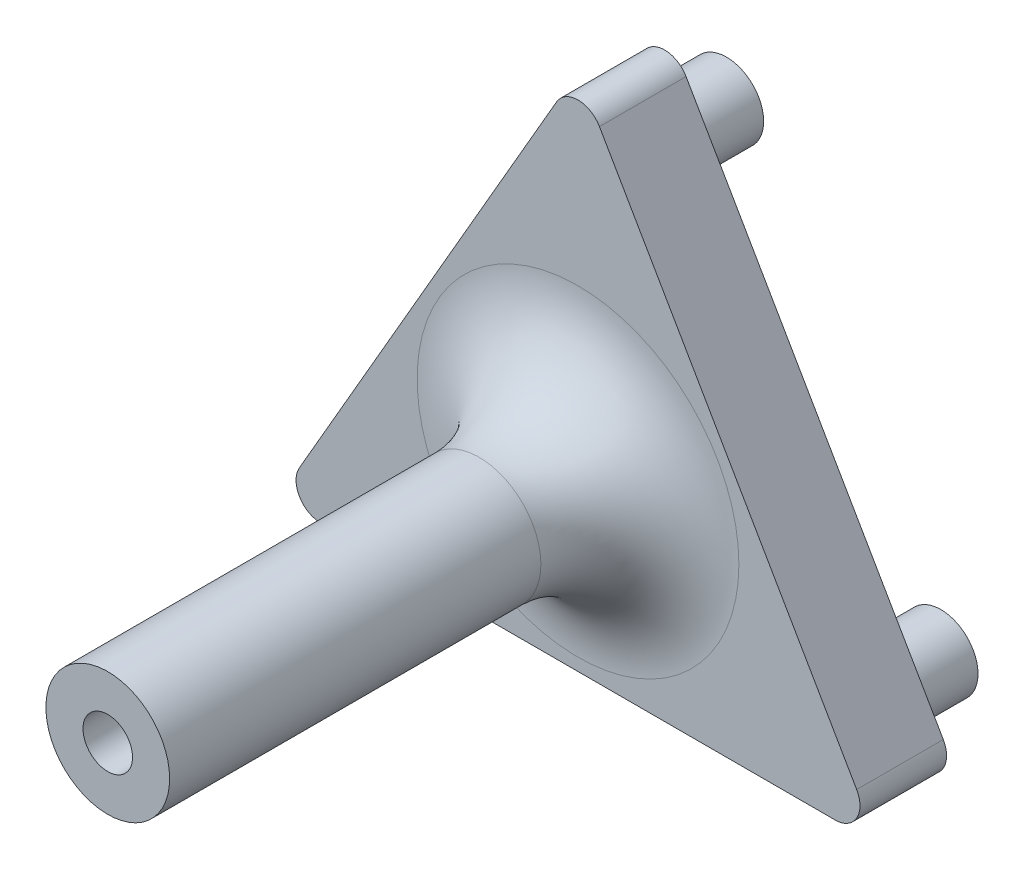
ISO-10303-21;
HEADER;
FILE_DESCRIPTION(('STEP AP214'),'2;1');
FILE_NAME('part.step','',(''),(''),'','','');
FILE_SCHEMA(('AUTOMOTIVE_DESIGN { 1 0 10303 214 1 1 1 1 }'));
ENDSEC;
DATA;
#1=APPLICATION_CONTEXT('core data for automotive mechanical design processes');
#2=APPLICATION_PROTOCOL_DEFINITION('international standard','automotive_design',2000,#1);
#3=PRODUCT_CONTEXT('',#1,'mechanical');
#4=PRODUCT('Part','Part','',(#3));
#5=PRODUCT_RELATED_PRODUCT_CATEGORY('part','',(#4));
#6=PRODUCT_DEFINITION_FORMATION('','',#4);
#7=PRODUCT_DEFINITION_CONTEXT('part definition',#1,'design');
#8=PRODUCT_DEFINITION('design','',#6,#7);
#9=PRODUCT_DEFINITION_SHAPE('','',#8);
#10=(LENGTH_UNIT() NAMED_UNIT(*) SI_UNIT(.MILLI.,.METRE.));
#11=(NAMED_UNIT(*) PLANE_ANGLE_UNIT() SI_UNIT($,.RADIAN.));
#12=(NAMED_UNIT(*) SI_UNIT($,.STERADIAN.) SOLID_ANGLE_UNIT());
#13=UNCERTAINTY_MEASURE_WITH_UNIT(LENGTH_MEASURE(1.E-05),#10,'distance_accuracy_value','');
#14=(GEOMETRIC_REPRESENTATION_CONTEXT(3) GLOBAL_UNCERTAINTY_ASSIGNED_CONTEXT((#13)) GLOBAL_UNIT_ASSIGNED_CONTEXT((#10,
#11,#12)) REPRESENTATION_CONTEXT('',''));
#15=CARTESIAN_POINT('',(0.,0.,0.));
#16=DIRECTION('',(0.,0.,1.));
#17=DIRECTION('',(1.,0.,0.));
#18=AXIS2_PLACEMENT_3D('',#15,#16,#17);
#19=CARTESIAN_POINT('',(0.,0.,1.5));
#20=DIRECTION('',(0.,0.,1.));
#21=DIRECTION('',(1.,0.,0.));
#22=AXIS2_PLACEMENT_3D('',#19,#20,#21);
#23=PLANE('',#22);
#24=CARTESIAN_POINT('',(0.,0.,1.5));
#25=DIRECTION('',(0.,0.,-1.));
#26=DIRECTION('',(-1.,0.,0.));
#27=AXIS2_PLACEMENT_3D('',#24,#25,#26);
#28=CIRCLE('',#27,3.7);
#29=CARTESIAN_POINT('',(-3.7,0.,1.5));
#30=VERTEX_POINT('',#29);
#31=EDGE_CURVE('E119',#30,#30,#28,.T.);
#32=ORIENTED_EDGE('',*,*,#31,.F.);
#33=EDGE_LOOP('',(#32));
#34=FACE_BOUND('',#33,.T.);
#35=DIRECTION('',(1.,0.,0.));
#36=VECTOR('',#35,1.);
#37=CARTESIAN_POINT('',(-12.1243556529822,-7.00000000000003,1.5));
#38=LINE('',#37,#36);
#39=CARTESIAN_POINT('',(-10.3923048454133,-7.00000000000003,1.5));
#40=VERTEX_POINT('',#39);
#41=CARTESIAN_POINT('',(10.3923048454133,-7.00000000000002,1.5));
#42=VERTEX_POINT('',#41);
#43=EDGE_CURVE('E338',#40,#42,#38,.T.);
#44=ORIENTED_EDGE('',*,*,#43,.F.);
#45=CARTESIAN_POINT('',(-10.3923048454133,-6.00000000000003,1.5));
#46=DIRECTION('',(0.,0.,1.));
#47=DIRECTION('',(1.,0.,0.));
#48=AXIS2_PLACEMENT_3D('',#45,#46,#47);
#49=CIRCLE('',#48,1.);
#50=CARTESIAN_POINT('',(-11.2583302491977,-5.50000000000003,1.5));
#51=VERTEX_POINT('',#50);
#52=EDGE_CURVE('E131',#40,#51,#49,.F.);
#53=ORIENTED_EDGE('',*,*,#52,.T.);
#54=DIRECTION('',(-0.5,-0.866025403784439,0.));
#55=VECTOR('',#54,1.);
#56=CARTESIAN_POINT('',(0.,14.,1.5));
#57=LINE('',#56,#55);
#58=CARTESIAN_POINT('',(-0.866025403784439,12.5,1.5));
#59=VERTEX_POINT('',#58);
#60=EDGE_CURVE('E339',#59,#51,#57,.T.);
#61=ORIENTED_EDGE('',*,*,#60,.F.);
#62=CARTESIAN_POINT('',(0.,12.,1.5));
#63=DIRECTION('',(0.,0.,1.));
#64=DIRECTION('',(1.,0.,0.));
#65=AXIS2_PLACEMENT_3D('',#62,#63,#64);
#66=CIRCLE('',#65,1.);
#67=CARTESIAN_POINT('',(0.866025403784439,12.5,1.5));
#68=VERTEX_POINT('',#67);
#69=EDGE_CURVE('E53',#59,#68,#66,.F.);
#70=ORIENTED_EDGE('',*,*,#69,.T.);
#71=DIRECTION('',(-0.5,0.866025403784439,0.));
#72=VECTOR('',#71,1.);
#73=CARTESIAN_POINT('',(12.1243556529822,-7.00000000000002,1.5));
#74=LINE('',#73,#72);
#75=CARTESIAN_POINT('',(11.2583302491977,-5.50000000000002,1.5));
#76=VERTEX_POINT('',#75);
#77=EDGE_CURVE('E342',#76,#68,#74,.T.);
#78=ORIENTED_EDGE('',*,*,#77,.F.);
#79=CARTESIAN_POINT('',(10.3923048454133,-6.00000000000002,1.5));
#80=DIRECTION('',(0.,0.,1.));
#81=DIRECTION('',(1.,0.,0.));
#82=AXIS2_PLACEMENT_3D('',#79,#80,#81);
#83=CIRCLE('',#82,1.);
#84=EDGE_CURVE('E135',#76,#42,#83,.F.);
#85=ORIENTED_EDGE('',*,*,#84,.T.);
#86=EDGE_LOOP('',(#44,#53,#61,#70,#78,#85));
#87=FACE_BOUND('',#86,.T.);
#88=CARTESIAN_POINT('',(8.66025403784503,-4.99999999999963,1.5));
#89=DIRECTION('',(0.,0.,1.));
#90=DIRECTION('',(1.,0.,0.));
#91=AXIS2_PLACEMENT_3D('',#88,#89,#90);
#92=CIRCLE('',#91,1.50000000000055);
#93=CARTESIAN_POINT('',(10.1602540378456,-4.99999999999963,1.5));
#94=VERTEX_POINT('',#93);
#95=EDGE_CURVE('E353',#94,#94,#92,.F.);
#96=ORIENTED_EDGE('',*,*,#95,.F.);
#97=EDGE_LOOP('',(#96));
#98=FACE_BOUND('',#97,.T.);
#99=CARTESIAN_POINT('',(-8.66025403784375,-5.00000000000037,1.5));
#100=DIRECTION('',(0.,0.,1.));
#101=DIRECTION('',(1.,0.,0.));
#102=AXIS2_PLACEMENT_3D('',#99,#100,#101);
#103=CIRCLE('',#102,1.5000000000008);
#104=CARTESIAN_POINT('',(-7.16025403784296,-5.00000000000037,1.5));
#105=VERTEX_POINT('',#104);
#106=EDGE_CURVE('E367',#105,#105,#103,.T.);
#107=ORIENTED_EDGE('',*,*,#106,.T.);
#108=EDGE_LOOP('',(#107));
#109=FACE_BOUND('',#108,.T.);
#110=CARTESIAN_POINT('',(0.,10.,1.5));
#111=DIRECTION('',(0.,0.,1.));
#112=DIRECTION('',(1.,0.,0.));
#113=AXIS2_PLACEMENT_3D('',#110,#111,#112);
#114=CIRCLE('',#113,1.5);
#115=CARTESIAN_POINT('',(1.5,10.,1.5));
#116=VERTEX_POINT('',#115);
#117=EDGE_CURVE('E350',#116,#116,#114,.T.);
#118=ORIENTED_EDGE('',*,*,#117,.T.);
#119=EDGE_LOOP('',(#118));
#120=FACE_BOUND('',#119,.T.);
#121=ADVANCED_FACE('F39',(#34,#87,#98,#109,#120),#23,.F.);
#122=CARTESIAN_POINT('',(12.1243556529822,-7.00000000000002,1.5));
#123=DIRECTION('',(0.866025403784439,0.5,0.));
#124=DIRECTION('',(-0.5,0.866025403784439,0.));
#125=AXIS2_PLACEMENT_3D('',#122,#123,#124);
#126=PLANE('',#125);
#127=ORIENTED_EDGE('',*,*,#77,.T.);
#128=DIRECTION('',(0.,0.,1.));
#129=VECTOR('',#128,1.);
#130=CARTESIAN_POINT('',(0.866025403784439,12.5,1.5));
#131=LINE('',#130,#129);
#132=CARTESIAN_POINT('',(0.866025403784439,12.5,5.));
#133=VERTEX_POINT('',#132);
#134=EDGE_CURVE('E138',#68,#133,#131,.T.);
#135=ORIENTED_EDGE('',*,*,#134,.T.);
#136=DIRECTION('',(-0.5,0.866025403784439,0.));
#137=VECTOR('',#136,1.);
#138=CARTESIAN_POINT('',(12.1243556529822,-7.00000000000002,5.));
#139=LINE('',#138,#137);
#140=CARTESIAN_POINT('',(11.2583302491977,-5.50000000000002,5.));
#141=VERTEX_POINT('',#140);
#142=EDGE_CURVE('E96',#141,#133,#139,.T.);
#143=ORIENTED_EDGE('',*,*,#142,.F.);
#144=DIRECTION('',(0.,0.,1.));
#145=VECTOR('',#144,1.);
#146=CARTESIAN_POINT('',(11.2583302491977,-5.50000000000002,1.5));
#147=LINE('',#146,#145);
#148=EDGE_CURVE('E61',#141,#76,#147,.F.);
#149=ORIENTED_EDGE('',*,*,#148,.T.);
#150=EDGE_LOOP('',(#127,#135,#143,#149));
#151=FACE_BOUND('',#150,.T.);
#152=ADVANCED_FACE('F153',(#151),#126,.T.);
#153=CARTESIAN_POINT('',(-12.1243556529822,-7.00000000000003,1.5));
#154=DIRECTION('',(0.,-1.,0.));
#155=DIRECTION('',(1.,0.,0.));
#156=AXIS2_PLACEMENT_3D('',#153,#154,#155);
#157=PLANE('',#156);
#158=DIRECTION('',(1.,0.,0.));
#159=VECTOR('',#158,1.);
#160=CARTESIAN_POINT('',(-12.1243556529822,-7.00000000000003,5.));
#161=LINE('',#160,#159);
#162=CARTESIAN_POINT('',(-10.3923048454133,-7.00000000000003,5.));
#163=VERTEX_POINT('',#162);
#164=CARTESIAN_POINT('',(10.3923048454133,-7.00000000000002,5.));
#165=VERTEX_POINT('',#164);
#166=EDGE_CURVE('E113',#163,#165,#161,.T.);
#167=ORIENTED_EDGE('',*,*,#166,.F.);
#168=DIRECTION('',(0.,0.,1.));
#169=VECTOR('',#168,1.);
#170=CARTESIAN_POINT('',(-10.3923048454133,-7.00000000000003,1.5));
#171=LINE('',#170,#169);
#172=EDGE_CURVE('E129',#163,#40,#171,.F.);
#173=ORIENTED_EDGE('',*,*,#172,.T.);
#174=ORIENTED_EDGE('',*,*,#43,.T.);
#175=DIRECTION('',(0.,0.,1.));
#176=VECTOR('',#175,1.);
#177=CARTESIAN_POINT('',(10.3923048454133,-7.00000000000002,1.5));
#178=LINE('',#177,#176);
#179=EDGE_CURVE('E130',#42,#165,#178,.T.);
#180=ORIENTED_EDGE('',*,*,#179,.T.);
#181=EDGE_LOOP('',(#167,#173,#174,#180));
#182=FACE_BOUND('',#181,.T.);
#183=ADVANCED_FACE('F159',(#182),#157,.T.);
#184=CARTESIAN_POINT('',(0.,14.,1.5));
#185=DIRECTION('',(-0.866025403784439,0.5,0.));
#186=DIRECTION('',(-0.5,-0.866025403784439,0.));
#187=AXIS2_PLACEMENT_3D('',#184,#185,#186);
#188=PLANE('',#187);
#189=ORIENTED_EDGE('',*,*,#60,.T.);
#190=DIRECTION('',(0.,0.,1.));
#191=VECTOR('',#190,1.);
#192=CARTESIAN_POINT('',(-11.2583302491977,-5.50000000000003,1.5));
#193=LINE('',#192,#191);
#194=CARTESIAN_POINT('',(-11.2583302491977,-5.50000000000003,5.));
#195=VERTEX_POINT('',#194);
#196=EDGE_CURVE('E115',#51,#195,#193,.T.);
#197=ORIENTED_EDGE('',*,*,#196,.T.);
#198=DIRECTION('',(-0.5,-0.866025403784439,0.));
#199=VECTOR('',#198,1.);
#200=CARTESIAN_POINT('',(0.,14.,5.));
#201=LINE('',#200,#199);
#202=CARTESIAN_POINT('',(-0.866025403784439,12.5,5.));
#203=VERTEX_POINT('',#202);
#204=EDGE_CURVE('E97',#203,#195,#201,.T.);
#205=ORIENTED_EDGE('',*,*,#204,.F.);
#206=DIRECTION('',(0.,0.,1.));
#207=VECTOR('',#206,1.);
#208=CARTESIAN_POINT('',(-0.866025403784439,12.5,1.5));
#209=LINE('',#208,#207);
#210=EDGE_CURVE('E109',#203,#59,#209,.F.);
#211=ORIENTED_EDGE('',*,*,#210,.T.);
#212=EDGE_LOOP('',(#189,#197,#205,#211));
#213=FACE_BOUND('',#212,.T.);
#214=ADVANCED_FACE('F107',(#213),#188,.T.);
#215=CARTESIAN_POINT('',(0.,0.,5.));
#216=DIRECTION('',(0.,0.,1.));
#217=DIRECTION('',(1.,0.,0.));
#218=AXIS2_PLACEMENT_3D('',#215,#216,#217);
#219=PLANE('',#218);
#220=CARTESIAN_POINT('',(0.,0.,5.));
#221=DIRECTION('',(0.,0.,1.));
#222=DIRECTION('',(1.,0.,0.));
#223=AXIS2_PLACEMENT_3D('',#220,#221,#222);
#224=CIRCLE('',#223,6.5);
#225=CARTESIAN_POINT('',(6.5,0.,5.));
#226=VERTEX_POINT('',#225);
#227=EDGE_CURVE('E50',#226,#226,#224,.F.);
#228=ORIENTED_EDGE('',*,*,#227,.T.);
#229=EDGE_LOOP('',(#228));
#230=FACE_BOUND('',#229,.T.);
#231=ORIENTED_EDGE('',*,*,#204,.T.);
#232=CARTESIAN_POINT('',(-10.3923048454133,-6.00000000000003,5.));
#233=DIRECTION('',(0.,0.,1.));
#234=DIRECTION('',(1.,0.,0.));
#235=AXIS2_PLACEMENT_3D('',#232,#233,#234);
#236=CIRCLE('',#235,1.);
#237=EDGE_CURVE('E101',#195,#163,#236,.T.);
#238=ORIENTED_EDGE('',*,*,#237,.T.);
#239=ORIENTED_EDGE('',*,*,#166,.T.);
#240=CARTESIAN_POINT('',(10.3923048454133,-6.00000000000002,5.));
#241=DIRECTION('',(0.,0.,1.));
#242=DIRECTION('',(1.,0.,0.));
#243=AXIS2_PLACEMENT_3D('',#240,#241,#242);
#244=CIRCLE('',#243,1.);
#245=EDGE_CURVE('E104',#165,#141,#244,.T.);
#246=ORIENTED_EDGE('',*,*,#245,.T.);
#247=ORIENTED_EDGE('',*,*,#142,.T.);
#248=CARTESIAN_POINT('',(0.,12.,5.));
#249=DIRECTION('',(0.,0.,1.));
#250=DIRECTION('',(1.,0.,0.));
#251=AXIS2_PLACEMENT_3D('',#248,#249,#250);
#252=CIRCLE('',#251,1.);
#253=EDGE_CURVE('E92',#133,#203,#252,.T.);
#254=ORIENTED_EDGE('',*,*,#253,.T.);
#255=EDGE_LOOP('',(#231,#238,#239,#246,#247,#254));
#256=FACE_BOUND('',#255,.T.);
#257=ADVANCED_FACE('F98',(#230,#256),#219,.T.);
#258=CARTESIAN_POINT('',(8.66025403784503,-4.99999999999963,-1.));
#259=DIRECTION('',(0.,0.,1.));
#260=DIRECTION('',(1.,0.,0.));
#261=AXIS2_PLACEMENT_3D('',#258,#259,#260);
#262=CYLINDRICAL_SURFACE('',#261,1.50000000000055);
#263=CARTESIAN_POINT('',(8.66025403784503,-4.99999999999963,-1.));
#264=DIRECTION('',(0.,0.,1.));
#265=DIRECTION('',(1.,0.,0.));
#266=AXIS2_PLACEMENT_3D('',#263,#264,#265);
#267=CIRCLE('',#266,1.50000000000055);
#268=CARTESIAN_POINT('',(10.1602540378456,-4.99999999999963,-1.));
#269=VERTEX_POINT('',#268);
#270=EDGE_CURVE('E334',#269,#269,#267,.T.);
#271=ORIENTED_EDGE('',*,*,#270,.T.);
#272=EDGE_LOOP('',(#271));
#273=FACE_BOUND('',#272,.T.);
#274=ORIENTED_EDGE('',*,*,#95,.T.);
#275=EDGE_LOOP('',(#274));
#276=FACE_BOUND('',#275,.T.);
#277=ADVANCED_FACE('F166',(#273,#276),#262,.T.);
#278=CARTESIAN_POINT('',(8.66025403784503,-4.99999999999963,-1.));
#279=DIRECTION('',(0.,0.,1.));
#280=DIRECTION('',(1.,0.,0.));
#281=AXIS2_PLACEMENT_3D('',#278,#279,#280);
#282=PLANE('',#281);
#283=ORIENTED_EDGE('',*,*,#270,.F.);
#284=EDGE_LOOP('',(#283));
#285=FACE_BOUND('',#284,.T.);
#286=ADVANCED_FACE('F180',(#285),#282,.F.);
#287=CARTESIAN_POINT('',(-8.66025403784375,-5.00000000000037,-1.));
#288=DIRECTION('',(0.,0.,1.));
#289=DIRECTION('',(1.,0.,0.));
#290=AXIS2_PLACEMENT_3D('',#287,#288,#289);
#291=CYLINDRICAL_SURFACE('',#290,1.5000000000008);
#292=CARTESIAN_POINT('',(-8.66025403784375,-5.00000000000037,-1.));
#293=DIRECTION('',(0.,0.,1.));
#294=DIRECTION('',(1.,0.,0.));
#295=AXIS2_PLACEMENT_3D('',#292,#293,#294);
#296=CIRCLE('',#295,1.5000000000008);
#297=CARTESIAN_POINT('',(-7.16025403784296,-5.00000000000037,-1.));
#298=VERTEX_POINT('',#297);
#299=EDGE_CURVE('E349',#298,#298,#296,.T.);
#300=ORIENTED_EDGE('',*,*,#299,.T.);
#301=EDGE_LOOP('',(#300));
#302=FACE_BOUND('',#301,.T.);
#303=ORIENTED_EDGE('',*,*,#106,.F.);
#304=EDGE_LOOP('',(#303));
#305=FACE_BOUND('',#304,.T.);
#306=ADVANCED_FACE('F173',(#302,#305),#291,.T.);
#307=CARTESIAN_POINT('',(-8.66025403784375,-5.00000000000037,-1.));
#308=DIRECTION('',(0.,0.,1.));
#309=DIRECTION('',(1.,0.,0.));
#310=AXIS2_PLACEMENT_3D('',#307,#308,#309);
#311=PLANE('',#310);
#312=ORIENTED_EDGE('',*,*,#299,.F.);
#313=EDGE_LOOP('',(#312));
#314=FACE_BOUND('',#313,.T.);
#315=ADVANCED_FACE('F169',(#314),#311,.F.);
#316=CARTESIAN_POINT('',(0.,10.,-1.));
#317=DIRECTION('',(0.,0.,1.));
#318=DIRECTION('',(1.,0.,0.));
#319=AXIS2_PLACEMENT_3D('',#316,#317,#318);
#320=CYLINDRICAL_SURFACE('',#319,1.5);
#321=CARTESIAN_POINT('',(0.,10.,-1.));
#322=DIRECTION('',(0.,0.,1.));
#323=DIRECTION('',(1.,0.,0.));
#324=AXIS2_PLACEMENT_3D('',#321,#322,#323);
#325=CIRCLE('',#324,1.5);
#326=CARTESIAN_POINT('',(1.5,10.,-1.));
#327=VERTEX_POINT('',#326);
#328=EDGE_CURVE('E355',#327,#327,#325,.T.);
#329=ORIENTED_EDGE('',*,*,#328,.T.);
#330=EDGE_LOOP('',(#329));
#331=FACE_BOUND('',#330,.T.);
#332=ORIENTED_EDGE('',*,*,#117,.F.);
#333=EDGE_LOOP('',(#332));
#334=FACE_BOUND('',#333,.T.);
#335=ADVANCED_FACE('F175',(#331,#334),#320,.T.);
#336=CARTESIAN_POINT('',(0.,10.,-1.));
#337=DIRECTION('',(0.,0.,1.));
#338=DIRECTION('',(1.,0.,0.));
#339=AXIS2_PLACEMENT_3D('',#336,#337,#338);
#340=PLANE('',#339);
#341=ORIENTED_EDGE('',*,*,#328,.F.);
#342=EDGE_LOOP('',(#341));
#343=FACE_BOUND('',#342,.T.);
#344=ADVANCED_FACE('F177',(#343),#340,.F.);
#345=CARTESIAN_POINT('',(0.,0.,24.));
#346=DIRECTION('',(0.,0.,-1.));
#347=DIRECTION('',(-1.,0.,0.));
#348=AXIS2_PLACEMENT_3D('',#345,#346,#347);
#349=CYLINDRICAL_SURFACE('',#348,1.);
#350=CARTESIAN_POINT('',(0.,0.,24.));
#351=DIRECTION('',(0.,0.,1.));
#352=DIRECTION('',(1.,0.,0.));
#353=AXIS2_PLACEMENT_3D('',#350,#351,#352);
#354=CIRCLE('',#353,1.);
#355=CARTESIAN_POINT('',(1.,0.,24.));
#356=VERTEX_POINT('',#355);
#357=EDGE_CURVE('E358',#356,#356,#354,.T.);
#358=ORIENTED_EDGE('',*,*,#357,.T.);
#359=EDGE_LOOP('',(#358));
#360=FACE_BOUND('',#359,.T.);
#361=CARTESIAN_POINT('',(0.,0.,3.5));
#362=DIRECTION('',(0.,0.,-1.));
#363=DIRECTION('',(-1.,0.,0.));
#364=AXIS2_PLACEMENT_3D('',#361,#362,#363);
#365=CIRCLE('',#364,1.);
#366=CARTESIAN_POINT('',(-1.,0.,3.5));
#367=VERTEX_POINT('',#366);
#368=EDGE_CURVE('E124',#367,#367,#365,.T.);
#369=ORIENTED_EDGE('',*,*,#368,.T.);
#370=EDGE_LOOP('',(#369));
#371=FACE_BOUND('',#370,.T.);
#372=ADVANCED_FACE('F185',(#360,#371),#349,.F.);
#373=CARTESIAN_POINT('',(0.,0.,24.));
#374=DIRECTION('',(0.,0.,1.));
#375=DIRECTION('',(1.,0.,0.));
#376=AXIS2_PLACEMENT_3D('',#373,#374,#375);
#377=PLANE('',#376);
#378=CARTESIAN_POINT('',(0.,0.,24.));
#379=DIRECTION('',(0.,0.,1.));
#380=DIRECTION('',(1.,0.,0.));
#381=AXIS2_PLACEMENT_3D('',#378,#379,#380);
#382=CIRCLE('',#381,2.5);
#383=CARTESIAN_POINT('',(2.5,0.,24.));
#384=VERTEX_POINT('',#383);
#385=EDGE_CURVE('E357',#384,#384,#382,.T.);
#386=ORIENTED_EDGE('',*,*,#385,.T.);
#387=EDGE_LOOP('',(#386));
#388=FACE_BOUND('',#387,.T.);
#389=ORIENTED_EDGE('',*,*,#357,.F.);
#390=EDGE_LOOP('',(#389));
#391=FACE_BOUND('',#390,.T.);
#392=ADVANCED_FACE('F190',(#388,#391),#377,.T.);
#393=CARTESIAN_POINT('',(0.,0.,24.));
#394=DIRECTION('',(0.,0.,-1.));
#395=DIRECTION('',(-1.,0.,0.));
#396=AXIS2_PLACEMENT_3D('',#393,#394,#395);
#397=CYLINDRICAL_SURFACE('',#396,2.5);
#398=CARTESIAN_POINT('',(0.,0.,9.));
#399=DIRECTION('',(0.,0.,1.));
#400=DIRECTION('',(1.,0.,0.));
#401=AXIS2_PLACEMENT_3D('',#398,#399,#400);
#402=CIRCLE('',#401,2.5);
#403=CARTESIAN_POINT('',(2.5,0.,9.));
#404=VERTEX_POINT('',#403);
#405=EDGE_CURVE('E11',#404,#404,#402,.T.);
#406=ORIENTED_EDGE('',*,*,#405,.T.);
#407=EDGE_LOOP('',(#406));
#408=FACE_BOUND('',#407,.T.);
#409=ORIENTED_EDGE('',*,*,#385,.F.);
#410=EDGE_LOOP('',(#409));
#411=FACE_BOUND('',#410,.T.);
#412=ADVANCED_FACE('F188',(#408,#411),#397,.T.);
#413=CARTESIAN_POINT('',(0.,0.,3.5));
#414=DIRECTION('',(0.,0.,-1.));
#415=DIRECTION('',(-1.,0.,0.));
#416=AXIS2_PLACEMENT_3D('',#413,#414,#415);
#417=CYLINDRICAL_SURFACE('',#416,3.7);
#418=CARTESIAN_POINT('',(0.,0.,3.5));
#419=DIRECTION('',(0.,0.,-1.));
#420=DIRECTION('',(-1.,0.,0.));
#421=AXIS2_PLACEMENT_3D('',#418,#419,#420);
#422=CIRCLE('',#421,3.7);
#423=CARTESIAN_POINT('',(-3.7,0.,3.5));
#424=VERTEX_POINT('',#423);
#425=EDGE_CURVE('E116',#424,#424,#422,.T.);
#426=ORIENTED_EDGE('',*,*,#425,.F.);
#427=EDGE_LOOP('',(#426));
#428=FACE_BOUND('',#427,.T.);
#429=ORIENTED_EDGE('',*,*,#31,.T.);
#430=EDGE_LOOP('',(#429));
#431=FACE_BOUND('',#430,.T.);
#432=ADVANCED_FACE('F194',(#428,#431),#417,.F.);
#433=CARTESIAN_POINT('',(0.,0.,3.5));
#434=DIRECTION('',(0.,0.,-1.));
#435=DIRECTION('',(-1.,0.,0.));
#436=AXIS2_PLACEMENT_3D('',#433,#434,#435);
#437=PLANE('',#436);
#438=ORIENTED_EDGE('',*,*,#368,.F.);
#439=EDGE_LOOP('',(#438));
#440=FACE_BOUND('',#439,.T.);
#441=ORIENTED_EDGE('',*,*,#425,.T.);
#442=EDGE_LOOP('',(#441));
#443=FACE_BOUND('',#442,.T.);
#444=ADVANCED_FACE('F198',(#440,#443),#437,.T.);
#445=CARTESIAN_POINT('',(-10.3923048454133,-6.00000000000003,1.5));
#446=DIRECTION('',(0.,0.,1.));
#447=DIRECTION('',(1.,0.,0.));
#448=AXIS2_PLACEMENT_3D('',#445,#446,#447);
#449=CYLINDRICAL_SURFACE('',#448,1.);
#450=ORIENTED_EDGE('',*,*,#52,.F.);
#451=ORIENTED_EDGE('',*,*,#172,.F.);
#452=ORIENTED_EDGE('',*,*,#237,.F.);
#453=ORIENTED_EDGE('',*,*,#196,.F.);
#454=EDGE_LOOP('',(#450,#451,#452,#453));
#455=FACE_BOUND('',#454,.T.);
#456=ADVANCED_FACE('F201',(#455),#449,.T.);
#457=CARTESIAN_POINT('',(0.,12.,1.5));
#458=DIRECTION('',(0.,0.,1.));
#459=DIRECTION('',(1.,0.,0.));
#460=AXIS2_PLACEMENT_3D('',#457,#458,#459);
#461=CYLINDRICAL_SURFACE('',#460,1.);
#462=ORIENTED_EDGE('',*,*,#69,.F.);
#463=ORIENTED_EDGE('',*,*,#210,.F.);
#464=ORIENTED_EDGE('',*,*,#253,.F.);
#465=ORIENTED_EDGE('',*,*,#134,.F.);
#466=EDGE_LOOP('',(#462,#463,#464,#465));
#467=FACE_BOUND('',#466,.T.);
#468=ADVANCED_FACE('F114',(#467),#461,.T.);
#469=CARTESIAN_POINT('',(10.3923048454133,-6.00000000000002,1.5));
#470=DIRECTION('',(0.,0.,1.));
#471=DIRECTION('',(1.,0.,0.));
#472=AXIS2_PLACEMENT_3D('',#469,#470,#471);
#473=CYLINDRICAL_SURFACE('',#472,1.);
#474=ORIENTED_EDGE('',*,*,#84,.F.);
#475=ORIENTED_EDGE('',*,*,#148,.F.);
#476=ORIENTED_EDGE('',*,*,#245,.F.);
#477=ORIENTED_EDGE('',*,*,#179,.F.);
#478=EDGE_LOOP('',(#474,#475,#476,#477));
#479=FACE_BOUND('',#478,.T.);
#480=ADVANCED_FACE('F144',(#479),#473,.T.);
#481=CARTESIAN_POINT('',(0.,0.,9.));
#482=DIRECTION('',(0.,0.,1.));
#483=DIRECTION('',(1.,0.,0.));
#484=AXIS2_PLACEMENT_3D('',#481,#482,#483);
#485=TOROIDAL_SURFACE('',#484,6.5,4.);
#486=ORIENTED_EDGE('',*,*,#405,.F.);
#487=EDGE_LOOP('',(#486));
#488=FACE_BOUND('',#487,.T.);
#489=ORIENTED_EDGE('',*,*,#227,.F.);
#490=EDGE_LOOP('',(#489));
#491=FACE_BOUND('',#490,.T.);
#492=ADVANCED_FACE('F41',(#488,#491),#485,.F.);
#493=CLOSED_SHELL('',(#121,#152,#183,#214,#257,#277,#286,#306,#315,#335,#344,#372,#392,#412,
#432,#444,#456,#468,#480,#492));
#494=MANIFOLD_SOLID_BREP('B2',#493);
#495=ADVANCED_BREP_SHAPE_REPRESENTATION('',(#18,#494),#14);
#496=SHAPE_DEFINITION_REPRESENTATION(#9,#495);
ENDSEC;
END-ISO-10303-21;
